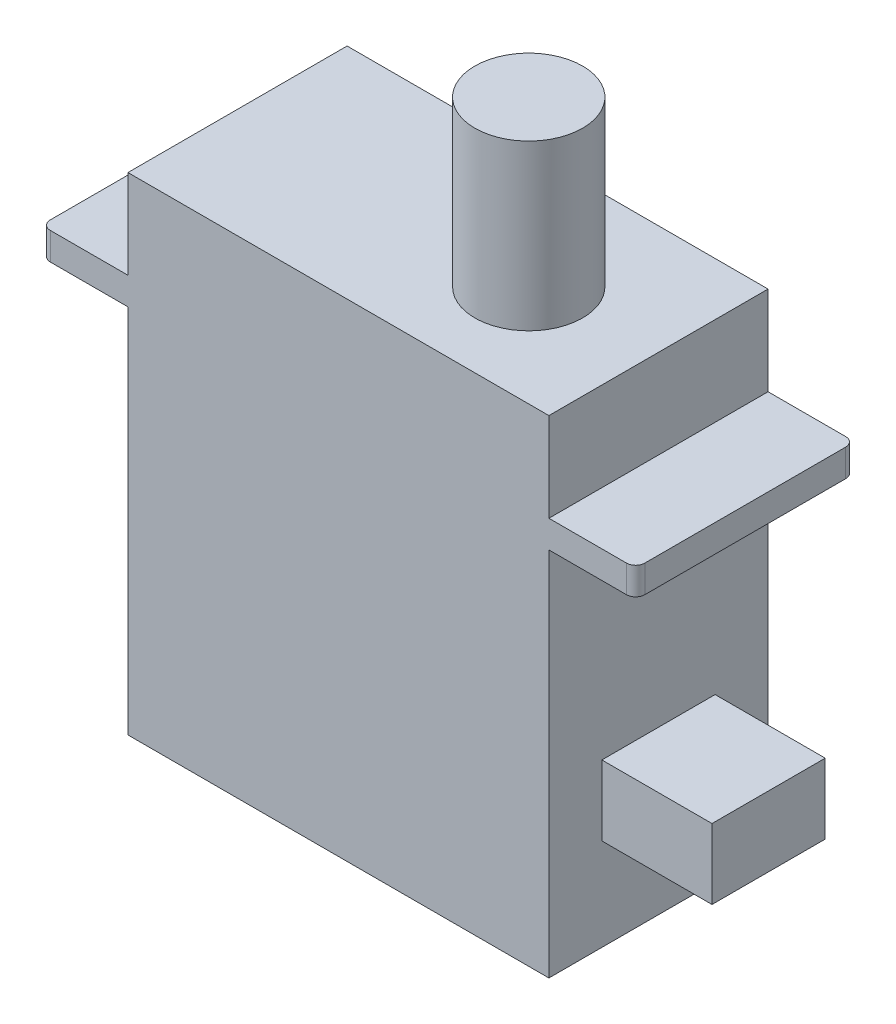
ISO-10303-21;
HEADER;
FILE_DESCRIPTION(('STEP AP214'),'2;1');
FILE_NAME('part.step','',(''),(''),'','','');
FILE_SCHEMA(('AUTOMOTIVE_DESIGN { 1 0 10303 214 1 1 1 1 }'));
ENDSEC;
DATA;
#1=APPLICATION_CONTEXT('core data for automotive mechanical design processes');
#2=APPLICATION_PROTOCOL_DEFINITION('international standard','automotive_design',2000,#1);
#3=PRODUCT_CONTEXT('',#1,'mechanical');
#4=PRODUCT('Part','Part','',(#3));
#5=PRODUCT_RELATED_PRODUCT_CATEGORY('part','',(#4));
#6=PRODUCT_DEFINITION_FORMATION('','',#4);
#7=PRODUCT_DEFINITION_CONTEXT('part definition',#1,'design');
#8=PRODUCT_DEFINITION('design','',#6,#7);
#9=PRODUCT_DEFINITION_SHAPE('','',#8);
#10=(LENGTH_UNIT() NAMED_UNIT(*) SI_UNIT(.MILLI.,.METRE.));
#11=(NAMED_UNIT(*) PLANE_ANGLE_UNIT() SI_UNIT($,.RADIAN.));
#12=(NAMED_UNIT(*) SI_UNIT($,.STERADIAN.) SOLID_ANGLE_UNIT());
#13=UNCERTAINTY_MEASURE_WITH_UNIT(LENGTH_MEASURE(1.E-05),#10,'distance_accuracy_value','');
#14=(GEOMETRIC_REPRESENTATION_CONTEXT(3) GLOBAL_UNCERTAINTY_ASSIGNED_CONTEXT((#13)) GLOBAL_UNIT_ASSIGNED_CONTEXT((#10,
#11,#12)) REPRESENTATION_CONTEXT('',''));
#15=CARTESIAN_POINT('',(0.,0.,0.));
#16=DIRECTION('',(0.,0.,1.));
#17=DIRECTION('',(1.,0.,0.));
#18=AXIS2_PLACEMENT_3D('',#15,#16,#17);
#19=CARTESIAN_POINT('',(23.05,0.,12.));
#20=DIRECTION('',(-1.,0.,0.));
#21=DIRECTION('',(0.,0.,1.));
#22=AXIS2_PLACEMENT_3D('',#19,#20,#21);
#23=PLANE('',#22);
#24=DIRECTION('',(0.,0.,-1.));
#25=VECTOR('',#24,1.);
#26=CARTESIAN_POINT('',(23.05,20.3,12.));
#27=LINE('',#26,#25);
#28=CARTESIAN_POINT('',(23.05,20.3,12.));
#29=VERTEX_POINT('',#28);
#30=CARTESIAN_POINT('',(23.05,20.3,0.));
#31=VERTEX_POINT('',#30);
#32=EDGE_CURVE('E221',#29,#31,#27,.T.);
#33=ORIENTED_EDGE('',*,*,#32,.F.);
#34=DIRECTION('',(0.,1.,0.));
#35=VECTOR('',#34,1.);
#36=CARTESIAN_POINT('',(23.05,0.,12.));
#37=LINE('',#36,#35);
#38=CARTESIAN_POINT('',(23.05,0.,12.));
#39=VERTEX_POINT('',#38);
#40=EDGE_CURVE('E252',#39,#29,#37,.T.);
#41=ORIENTED_EDGE('',*,*,#40,.F.);
#42=DIRECTION('',(0.,0.,-1.));
#43=VECTOR('',#42,1.);
#44=CARTESIAN_POINT('',(23.05,0.,12.));
#45=LINE('',#44,#43);
#46=CARTESIAN_POINT('',(23.05,0.,0.));
#47=VERTEX_POINT('',#46);
#48=EDGE_CURVE('E273',#39,#47,#45,.T.);
#49=ORIENTED_EDGE('',*,*,#48,.T.);
#50=DIRECTION('',(0.,1.,0.));
#51=VECTOR('',#50,1.);
#52=CARTESIAN_POINT('',(23.05,0.,0.));
#53=LINE('',#52,#51);
#54=EDGE_CURVE('E262',#47,#31,#53,.T.);
#55=ORIENTED_EDGE('',*,*,#54,.T.);
#56=EDGE_LOOP('',(#33,#41,#49,#55));
#57=FACE_BOUND('',#56,.T.);
#58=DIRECTION('',(0.,-1.,0.));
#59=VECTOR('',#58,1.);
#60=CARTESIAN_POINT('',(23.05,8.89,9.1));
#61=LINE('',#60,#59);
#62=CARTESIAN_POINT('',(23.05,8.89,9.1));
#63=VERTEX_POINT('',#62);
#64=CARTESIAN_POINT('',(23.05,5.05,9.1));
#65=VERTEX_POINT('',#64);
#66=EDGE_CURVE('E196',#63,#65,#61,.T.);
#67=ORIENTED_EDGE('',*,*,#66,.F.);
#68=DIRECTION('',(0.,0.,1.));
#69=VECTOR('',#68,1.);
#70=CARTESIAN_POINT('',(23.05,8.89,9.1));
#71=LINE('',#70,#69);
#72=CARTESIAN_POINT('',(23.05,8.89,2.9));
#73=VERTEX_POINT('',#72);
#74=EDGE_CURVE('E194',#73,#63,#71,.T.);
#75=ORIENTED_EDGE('',*,*,#74,.F.);
#76=DIRECTION('',(0.,1.,0.));
#77=VECTOR('',#76,1.);
#78=CARTESIAN_POINT('',(23.05,8.89,2.9));
#79=LINE('',#78,#77);
#80=CARTESIAN_POINT('',(23.05,5.05,2.9));
#81=VERTEX_POINT('',#80);
#82=EDGE_CURVE('E63',#81,#73,#79,.T.);
#83=ORIENTED_EDGE('',*,*,#82,.F.);
#84=DIRECTION('',(0.,0.,-1.));
#85=VECTOR('',#84,1.);
#86=CARTESIAN_POINT('',(23.05,5.05,9.1));
#87=LINE('',#86,#85);
#88=EDGE_CURVE('E57',#65,#81,#87,.T.);
#89=ORIENTED_EDGE('',*,*,#88,.F.);
#90=EDGE_LOOP('',(#67,#75,#83,#89));
#91=FACE_BOUND('',#90,.T.);
#92=ADVANCED_FACE('F41',(#57,#91),#23,.F.);
#93=CARTESIAN_POINT('',(0.,0.,12.));
#94=DIRECTION('',(1.,0.,0.));
#95=DIRECTION('',(0.,0.,-1.));
#96=AXIS2_PLACEMENT_3D('',#93,#94,#95);
#97=PLANE('',#96);
#98=DIRECTION('',(0.,0.,-1.));
#99=VECTOR('',#98,1.);
#100=CARTESIAN_POINT('',(0.,21.8,0.));
#101=LINE('',#100,#99);
#102=CARTESIAN_POINT('',(0.,21.8,12.));
#103=VERTEX_POINT('',#102);
#104=CARTESIAN_POINT('',(0.,21.8,0.));
#105=VERTEX_POINT('',#104);
#106=EDGE_CURVE('E205',#103,#105,#101,.T.);
#107=ORIENTED_EDGE('',*,*,#106,.F.);
#108=DIRECTION('',(0.,-1.,0.));
#109=VECTOR('',#108,1.);
#110=CARTESIAN_POINT('',(0.,0.,12.));
#111=LINE('',#110,#109);
#112=CARTESIAN_POINT('',(0.,26.67,12.));
#113=VERTEX_POINT('',#112);
#114=EDGE_CURVE('E241',#113,#103,#111,.T.);
#115=ORIENTED_EDGE('',*,*,#114,.F.);
#116=DIRECTION('',(0.,0.,-1.));
#117=VECTOR('',#116,1.);
#118=CARTESIAN_POINT('',(0.,26.67,12.));
#119=LINE('',#118,#117);
#120=CARTESIAN_POINT('',(0.,26.67,0.));
#121=VERTEX_POINT('',#120);
#122=EDGE_CURVE('E260',#113,#121,#119,.T.);
#123=ORIENTED_EDGE('',*,*,#122,.T.);
#124=DIRECTION('',(0.,-1.,0.));
#125=VECTOR('',#124,1.);
#126=CARTESIAN_POINT('',(0.,0.,0.));
#127=LINE('',#126,#125);
#128=EDGE_CURVE('E256',#121,#105,#127,.T.);
#129=ORIENTED_EDGE('',*,*,#128,.T.);
#130=EDGE_LOOP('',(#107,#115,#123,#129));
#131=FACE_BOUND('',#130,.T.);
#132=ADVANCED_FACE('F386',(#131),#97,.F.);
#133=DIRECTION('',(0.,0.,1.));
#134=VECTOR('',#133,1.);
#135=CARTESIAN_POINT('',(0.,20.3,0.));
#136=LINE('',#135,#134);
#137=CARTESIAN_POINT('',(0.,20.3,0.));
#138=VERTEX_POINT('',#137);
#139=CARTESIAN_POINT('',(0.,20.3,12.));
#140=VERTEX_POINT('',#139);
#141=EDGE_CURVE('E200',#138,#140,#136,.T.);
#142=ORIENTED_EDGE('',*,*,#141,.F.);
#143=CARTESIAN_POINT('',(0.,0.,0.));
#144=VERTEX_POINT('',#143);
#145=EDGE_CURVE('E245',#138,#144,#127,.T.);
#146=ORIENTED_EDGE('',*,*,#145,.T.);
#147=DIRECTION('',(0.,0.,-1.));
#148=VECTOR('',#147,1.);
#149=CARTESIAN_POINT('',(0.,0.,12.));
#150=LINE('',#149,#148);
#151=CARTESIAN_POINT('',(0.,0.,12.));
#152=VERTEX_POINT('',#151);
#153=EDGE_CURVE('E280',#152,#144,#150,.T.);
#154=ORIENTED_EDGE('',*,*,#153,.F.);
#155=EDGE_CURVE('E247',#140,#152,#111,.T.);
#156=ORIENTED_EDGE('',*,*,#155,.F.);
#157=EDGE_LOOP('',(#142,#146,#154,#156));
#158=FACE_BOUND('',#157,.T.);
#159=ADVANCED_FACE('F342',(#158),#97,.F.);
#160=DIRECTION('',(0.,0.,1.));
#161=VECTOR('',#160,1.);
#162=CARTESIAN_POINT('',(23.05,21.8,12.));
#163=LINE('',#162,#161);
#164=CARTESIAN_POINT('',(23.05,21.8,0.));
#165=VERTEX_POINT('',#164);
#166=CARTESIAN_POINT('',(23.05,21.8,12.));
#167=VERTEX_POINT('',#166);
#168=EDGE_CURVE('E227',#165,#167,#163,.T.);
#169=ORIENTED_EDGE('',*,*,#168,.F.);
#170=CARTESIAN_POINT('',(23.05,26.67,0.));
#171=VERTEX_POINT('',#170);
#172=EDGE_CURVE('E263',#165,#171,#53,.T.);
#173=ORIENTED_EDGE('',*,*,#172,.T.);
#174=DIRECTION('',(0.,0.,-1.));
#175=VECTOR('',#174,1.);
#176=CARTESIAN_POINT('',(23.05,26.67,12.));
#177=LINE('',#176,#175);
#178=CARTESIAN_POINT('',(23.05,26.67,12.));
#179=VERTEX_POINT('',#178);
#180=EDGE_CURVE('E271',#179,#171,#177,.T.);
#181=ORIENTED_EDGE('',*,*,#180,.F.);
#182=EDGE_CURVE('E253',#167,#179,#37,.T.);
#183=ORIENTED_EDGE('',*,*,#182,.F.);
#184=EDGE_LOOP('',(#169,#173,#181,#183));
#185=FACE_BOUND('',#184,.T.);
#186=ADVANCED_FACE('F379',(#185),#23,.F.);
#187=CARTESIAN_POINT('',(0.,0.,12.));
#188=DIRECTION('',(0.,1.,0.));
#189=DIRECTION('',(0.,0.,1.));
#190=AXIS2_PLACEMENT_3D('',#187,#188,#189);
#191=PLANE('',#190);
#192=DIRECTION('',(1.,0.,0.));
#193=VECTOR('',#192,1.);
#194=CARTESIAN_POINT('',(0.,0.,0.));
#195=LINE('',#194,#193);
#196=EDGE_CURVE('E261',#144,#47,#195,.T.);
#197=ORIENTED_EDGE('',*,*,#196,.T.);
#198=ORIENTED_EDGE('',*,*,#48,.F.);
#199=DIRECTION('',(1.,0.,0.));
#200=VECTOR('',#199,1.);
#201=CARTESIAN_POINT('',(0.,0.,12.));
#202=LINE('',#201,#200);
#203=EDGE_CURVE('E246',#152,#39,#202,.T.);
#204=ORIENTED_EDGE('',*,*,#203,.F.);
#205=ORIENTED_EDGE('',*,*,#153,.T.);
#206=EDGE_LOOP('',(#197,#198,#204,#205));
#207=FACE_BOUND('',#206,.T.);
#208=ADVANCED_FACE('F349',(#207),#191,.F.);
#209=CARTESIAN_POINT('',(0.,26.67,12.));
#210=DIRECTION('',(0.,-1.,0.));
#211=DIRECTION('',(0.,0.,-1.));
#212=AXIS2_PLACEMENT_3D('',#209,#210,#211);
#213=PLANE('',#212);
#214=CARTESIAN_POINT('',(16.3955675032536,26.67,6.44973763746406));
#215=DIRECTION('',(0.,-1.,0.));
#216=DIRECTION('',(0.,0.,-1.));
#217=AXIS2_PLACEMENT_3D('',#214,#215,#216);
#218=CIRCLE('',#217,2.95);
#219=CARTESIAN_POINT('',(16.3955675032536,26.67,3.49973763746406));
#220=VERTEX_POINT('',#219);
#221=EDGE_CURVE('E11',#220,#220,#218,.F.);
#222=ORIENTED_EDGE('',*,*,#221,.F.);
#223=EDGE_LOOP('',(#222));
#224=FACE_BOUND('',#223,.T.);
#225=DIRECTION('',(-1.,0.,0.));
#226=VECTOR('',#225,1.);
#227=CARTESIAN_POINT('',(0.,26.67,0.));
#228=LINE('',#227,#226);
#229=EDGE_CURVE('E270',#171,#121,#228,.T.);
#230=ORIENTED_EDGE('',*,*,#229,.T.);
#231=ORIENTED_EDGE('',*,*,#122,.F.);
#232=DIRECTION('',(-1.,0.,0.));
#233=VECTOR('',#232,1.);
#234=CARTESIAN_POINT('',(0.,26.67,12.));
#235=LINE('',#234,#233);
#236=EDGE_CURVE('E254',#179,#113,#235,.T.);
#237=ORIENTED_EDGE('',*,*,#236,.F.);
#238=ORIENTED_EDGE('',*,*,#180,.T.);
#239=EDGE_LOOP('',(#230,#231,#237,#238));
#240=FACE_BOUND('',#239,.T.);
#241=ADVANCED_FACE('F383',(#224,#240),#213,.F.);
#242=CARTESIAN_POINT('',(0.,0.,12.));
#243=DIRECTION('',(0.,0.,-1.));
#244=DIRECTION('',(-1.,0.,0.));
#245=AXIS2_PLACEMENT_3D('',#242,#243,#244);
#246=PLANE('',#245);
#247=DIRECTION('',(1.,0.,0.));
#248=VECTOR('',#247,1.);
#249=CARTESIAN_POINT('',(-4.75,21.8,12.));
#250=LINE('',#249,#248);
#251=CARTESIAN_POINT('',(-4.25,21.8,12.));
#252=VERTEX_POINT('',#251);
#253=EDGE_CURVE('E217',#252,#103,#250,.T.);
#254=ORIENTED_EDGE('',*,*,#253,.F.);
#255=DIRECTION('',(0.,1.,0.));
#256=VECTOR('',#255,1.);
#257=CARTESIAN_POINT('',(-4.25,20.3,12.));
#258=LINE('',#257,#256);
#259=CARTESIAN_POINT('',(-4.25,20.3,12.));
#260=VERTEX_POINT('',#259);
#261=EDGE_CURVE('E47',#252,#260,#258,.F.);
#262=ORIENTED_EDGE('',*,*,#261,.T.);
#263=DIRECTION('',(1.,0.,0.));
#264=VECTOR('',#263,1.);
#265=CARTESIAN_POINT('',(-4.75,20.3,12.));
#266=LINE('',#265,#264);
#267=EDGE_CURVE('E219',#260,#140,#266,.T.);
#268=ORIENTED_EDGE('',*,*,#267,.T.);
#269=ORIENTED_EDGE('',*,*,#155,.T.);
#270=ORIENTED_EDGE('',*,*,#203,.T.);
#271=ORIENTED_EDGE('',*,*,#40,.T.);
#272=DIRECTION('',(-1.,0.,0.));
#273=VECTOR('',#272,1.);
#274=CARTESIAN_POINT('',(27.8,20.3,12.));
#275=LINE('',#274,#273);
#276=CARTESIAN_POINT('',(27.3,20.3,12.));
#277=VERTEX_POINT('',#276);
#278=EDGE_CURVE('E244',#277,#29,#275,.T.);
#279=ORIENTED_EDGE('',*,*,#278,.F.);
#280=DIRECTION('',(0.,-1.,0.));
#281=VECTOR('',#280,1.);
#282=CARTESIAN_POINT('',(27.3,21.8,12.));
#283=LINE('',#282,#281);
#284=CARTESIAN_POINT('',(27.3,21.8,12.));
#285=VERTEX_POINT('',#284);
#286=EDGE_CURVE('E298',#277,#285,#283,.F.);
#287=ORIENTED_EDGE('',*,*,#286,.T.);
#288=DIRECTION('',(-1.,0.,0.));
#289=VECTOR('',#288,1.);
#290=CARTESIAN_POINT('',(27.8,21.8,12.));
#291=LINE('',#290,#289);
#292=EDGE_CURVE('E231',#285,#167,#291,.T.);
#293=ORIENTED_EDGE('',*,*,#292,.T.);
#294=ORIENTED_EDGE('',*,*,#182,.T.);
#295=ORIENTED_EDGE('',*,*,#236,.T.);
#296=ORIENTED_EDGE('',*,*,#114,.T.);
#297=EDGE_LOOP('',(#254,#262,#268,#269,#270,#271,#279,#287,#293,#294,#295,#296));
#298=FACE_BOUND('',#297,.T.);
#299=ADVANCED_FACE('F320',(#298),#246,.F.);
#300=CARTESIAN_POINT('',(0.,0.,0.));
#301=DIRECTION('',(0.,0.,-1.));
#302=DIRECTION('',(-1.,0.,0.));
#303=AXIS2_PLACEMENT_3D('',#300,#301,#302);
#304=PLANE('',#303);
#305=DIRECTION('',(1.,0.,0.));
#306=VECTOR('',#305,1.);
#307=CARTESIAN_POINT('',(-4.75,20.3,0.));
#308=LINE('',#307,#306);
#309=CARTESIAN_POINT('',(-4.25,20.3,0.));
#310=VERTEX_POINT('',#309);
#311=EDGE_CURVE('E225',#310,#138,#308,.T.);
#312=ORIENTED_EDGE('',*,*,#311,.F.);
#313=DIRECTION('',(0.,-1.,0.));
#314=VECTOR('',#313,1.);
#315=CARTESIAN_POINT('',(-4.25,0.,0.));
#316=LINE('',#315,#314);
#317=CARTESIAN_POINT('',(-4.25,21.8,0.));
#318=VERTEX_POINT('',#317);
#319=EDGE_CURVE('E306',#310,#318,#316,.F.);
#320=ORIENTED_EDGE('',*,*,#319,.T.);
#321=DIRECTION('',(1.,0.,0.));
#322=VECTOR('',#321,1.);
#323=CARTESIAN_POINT('',(-4.75,21.8,0.));
#324=LINE('',#323,#322);
#325=EDGE_CURVE('E213',#318,#105,#324,.T.);
#326=ORIENTED_EDGE('',*,*,#325,.T.);
#327=ORIENTED_EDGE('',*,*,#128,.F.);
#328=ORIENTED_EDGE('',*,*,#229,.F.);
#329=ORIENTED_EDGE('',*,*,#172,.F.);
#330=DIRECTION('',(-1.,0.,0.));
#331=VECTOR('',#330,1.);
#332=CARTESIAN_POINT('',(27.8,21.8,0.));
#333=LINE('',#332,#331);
#334=CARTESIAN_POINT('',(27.3,21.8,0.));
#335=VERTEX_POINT('',#334);
#336=EDGE_CURVE('E236',#335,#165,#333,.T.);
#337=ORIENTED_EDGE('',*,*,#336,.F.);
#338=DIRECTION('',(0.,1.,0.));
#339=VECTOR('',#338,1.);
#340=CARTESIAN_POINT('',(27.3,0.,0.));
#341=LINE('',#340,#339);
#342=CARTESIAN_POINT('',(27.3,20.3,0.));
#343=VERTEX_POINT('',#342);
#344=EDGE_CURVE('E287',#335,#343,#341,.F.);
#345=ORIENTED_EDGE('',*,*,#344,.T.);
#346=DIRECTION('',(-1.,0.,0.));
#347=VECTOR('',#346,1.);
#348=CARTESIAN_POINT('',(27.8,20.3,0.));
#349=LINE('',#348,#347);
#350=EDGE_CURVE('E238',#343,#31,#349,.T.);
#351=ORIENTED_EDGE('',*,*,#350,.T.);
#352=ORIENTED_EDGE('',*,*,#54,.F.);
#353=ORIENTED_EDGE('',*,*,#196,.F.);
#354=ORIENTED_EDGE('',*,*,#145,.F.);
#355=EDGE_LOOP('',(#312,#320,#326,#327,#328,#329,#337,#345,#351,#352,#353,#354));
#356=FACE_BOUND('',#355,.T.);
#357=ADVANCED_FACE('F339',(#356),#304,.T.);
#358=CARTESIAN_POINT('',(27.8,20.3,12.));
#359=DIRECTION('',(0.,1.,0.));
#360=DIRECTION('',(0.,0.,1.));
#361=AXIS2_PLACEMENT_3D('',#358,#359,#360);
#362=PLANE('',#361);
#363=ORIENTED_EDGE('',*,*,#350,.F.);
#364=CARTESIAN_POINT('',(27.3,20.3,0.5));
#365=DIRECTION('',(0.,1.,0.));
#366=DIRECTION('',(0.,0.,1.));
#367=AXIS2_PLACEMENT_3D('',#364,#365,#366);
#368=CIRCLE('',#367,0.5);
#369=CARTESIAN_POINT('',(27.8,20.3,0.5));
#370=VERTEX_POINT('',#369);
#371=EDGE_CURVE('E294',#343,#370,#368,.F.);
#372=ORIENTED_EDGE('',*,*,#371,.T.);
#373=DIRECTION('',(0.,0.,-1.));
#374=VECTOR('',#373,1.);
#375=CARTESIAN_POINT('',(27.8,20.3,12.));
#376=LINE('',#375,#374);
#377=CARTESIAN_POINT('',(27.8,20.3,11.5));
#378=VERTEX_POINT('',#377);
#379=EDGE_CURVE('E223',#378,#370,#376,.T.);
#380=ORIENTED_EDGE('',*,*,#379,.F.);
#381=CARTESIAN_POINT('',(27.3,20.3,11.5));
#382=DIRECTION('',(0.,1.,0.));
#383=DIRECTION('',(0.,0.,1.));
#384=AXIS2_PLACEMENT_3D('',#381,#382,#383);
#385=CIRCLE('',#384,0.5);
#386=EDGE_CURVE('E295',#378,#277,#385,.F.);
#387=ORIENTED_EDGE('',*,*,#386,.T.);
#388=ORIENTED_EDGE('',*,*,#278,.T.);
#389=ORIENTED_EDGE('',*,*,#32,.T.);
#390=EDGE_LOOP('',(#363,#372,#380,#387,#388,#389));
#391=FACE_BOUND('',#390,.T.);
#392=ADVANCED_FACE('F423',(#391),#362,.F.);
#393=CARTESIAN_POINT('',(27.8,21.8,12.));
#394=DIRECTION('',(0.,-1.,0.));
#395=DIRECTION('',(0.,0.,-1.));
#396=AXIS2_PLACEMENT_3D('',#393,#394,#395);
#397=PLANE('',#396);
#398=DIRECTION('',(0.,0.,1.));
#399=VECTOR('',#398,1.);
#400=CARTESIAN_POINT('',(27.8,21.8,12.));
#401=LINE('',#400,#399);
#402=CARTESIAN_POINT('',(27.8,21.8,0.5));
#403=VERTEX_POINT('',#402);
#404=CARTESIAN_POINT('',(27.8,21.8,11.5));
#405=VERTEX_POINT('',#404);
#406=EDGE_CURVE('E226',#403,#405,#401,.T.);
#407=ORIENTED_EDGE('',*,*,#406,.F.);
#408=CARTESIAN_POINT('',(27.3,21.8,0.5));
#409=DIRECTION('',(0.,-1.,0.));
#410=DIRECTION('',(0.,0.,-1.));
#411=AXIS2_PLACEMENT_3D('',#408,#409,#410);
#412=CIRCLE('',#411,0.5);
#413=EDGE_CURVE('E290',#403,#335,#412,.F.);
#414=ORIENTED_EDGE('',*,*,#413,.T.);
#415=ORIENTED_EDGE('',*,*,#336,.T.);
#416=ORIENTED_EDGE('',*,*,#168,.T.);
#417=ORIENTED_EDGE('',*,*,#292,.F.);
#418=CARTESIAN_POINT('',(27.3,21.8,11.5));
#419=DIRECTION('',(0.,-1.,0.));
#420=DIRECTION('',(0.,0.,-1.));
#421=AXIS2_PLACEMENT_3D('',#418,#419,#420);
#422=CIRCLE('',#421,0.5);
#423=EDGE_CURVE('E289',#285,#405,#422,.F.);
#424=ORIENTED_EDGE('',*,*,#423,.T.);
#425=EDGE_LOOP('',(#407,#414,#415,#416,#417,#424));
#426=FACE_BOUND('',#425,.T.);
#427=ADVANCED_FACE('F361',(#426),#397,.F.);
#428=CARTESIAN_POINT('',(27.8,0.,0.));
#429=DIRECTION('',(1.,0.,0.));
#430=DIRECTION('',(0.,0.,-1.));
#431=AXIS2_PLACEMENT_3D('',#428,#429,#430);
#432=PLANE('',#431);
#433=ORIENTED_EDGE('',*,*,#379,.T.);
#434=DIRECTION('',(0.,1.,0.));
#435=VECTOR('',#434,1.);
#436=CARTESIAN_POINT('',(27.8,0.,0.5));
#437=LINE('',#436,#435);
#438=EDGE_CURVE('E281',#370,#403,#437,.T.);
#439=ORIENTED_EDGE('',*,*,#438,.T.);
#440=ORIENTED_EDGE('',*,*,#406,.T.);
#441=DIRECTION('',(0.,-1.,0.));
#442=VECTOR('',#441,1.);
#443=CARTESIAN_POINT('',(27.8,20.3,11.5));
#444=LINE('',#443,#442);
#445=EDGE_CURVE('E278',#405,#378,#444,.T.);
#446=ORIENTED_EDGE('',*,*,#445,.T.);
#447=EDGE_LOOP('',(#433,#439,#440,#446));
#448=FACE_BOUND('',#447,.T.);
#449=ADVANCED_FACE('F364',(#448),#432,.T.);
#450=CARTESIAN_POINT('',(27.3,0.,0.5));
#451=DIRECTION('',(0.,1.,0.));
#452=DIRECTION('',(0.,0.,1.));
#453=AXIS2_PLACEMENT_3D('',#450,#451,#452);
#454=CYLINDRICAL_SURFACE('',#453,0.5);
#455=ORIENTED_EDGE('',*,*,#371,.F.);
#456=ORIENTED_EDGE('',*,*,#344,.F.);
#457=ORIENTED_EDGE('',*,*,#413,.F.);
#458=ORIENTED_EDGE('',*,*,#438,.F.);
#459=EDGE_LOOP('',(#455,#456,#457,#458));
#460=FACE_BOUND('',#459,.T.);
#461=ADVANCED_FACE('F367',(#460),#454,.T.);
#462=CARTESIAN_POINT('',(27.3,0.,11.5));
#463=DIRECTION('',(0.,1.,0.));
#464=DIRECTION('',(0.,0.,1.));
#465=AXIS2_PLACEMENT_3D('',#462,#463,#464);
#466=CYLINDRICAL_SURFACE('',#465,0.5);
#467=ORIENTED_EDGE('',*,*,#423,.F.);
#468=ORIENTED_EDGE('',*,*,#286,.F.);
#469=ORIENTED_EDGE('',*,*,#386,.F.);
#470=ORIENTED_EDGE('',*,*,#445,.F.);
#471=EDGE_LOOP('',(#467,#468,#469,#470));
#472=FACE_BOUND('',#471,.T.);
#473=ADVANCED_FACE('F357',(#472),#466,.T.);
#474=CARTESIAN_POINT('',(-4.75,20.3,0.));
#475=DIRECTION('',(0.,1.,0.));
#476=DIRECTION('',(0.,0.,1.));
#477=AXIS2_PLACEMENT_3D('',#474,#475,#476);
#478=PLANE('',#477);
#479=DIRECTION('',(0.,0.,1.));
#480=VECTOR('',#479,1.);
#481=CARTESIAN_POINT('',(-4.75,20.3,0.));
#482=LINE('',#481,#480);
#483=CARTESIAN_POINT('',(-4.75,20.3,0.5));
#484=VERTEX_POINT('',#483);
#485=CARTESIAN_POINT('',(-4.75,20.3,11.5));
#486=VERTEX_POINT('',#485);
#487=EDGE_CURVE('E208',#484,#486,#482,.T.);
#488=ORIENTED_EDGE('',*,*,#487,.F.);
#489=CARTESIAN_POINT('',(-4.25,20.3,0.5));
#490=DIRECTION('',(0.,1.,0.));
#491=DIRECTION('',(0.,0.,1.));
#492=AXIS2_PLACEMENT_3D('',#489,#490,#491);
#493=CIRCLE('',#492,0.5);
#494=EDGE_CURVE('E308',#484,#310,#493,.F.);
#495=ORIENTED_EDGE('',*,*,#494,.T.);
#496=ORIENTED_EDGE('',*,*,#311,.T.);
#497=ORIENTED_EDGE('',*,*,#141,.T.);
#498=ORIENTED_EDGE('',*,*,#267,.F.);
#499=CARTESIAN_POINT('',(-4.25,20.3,11.5));
#500=DIRECTION('',(0.,1.,0.));
#501=DIRECTION('',(0.,0.,1.));
#502=AXIS2_PLACEMENT_3D('',#499,#500,#501);
#503=CIRCLE('',#502,0.5);
#504=EDGE_CURVE('E302',#260,#486,#503,.F.);
#505=ORIENTED_EDGE('',*,*,#504,.T.);
#506=EDGE_LOOP('',(#488,#495,#496,#497,#498,#505));
#507=FACE_BOUND('',#506,.T.);
#508=ADVANCED_FACE('F323',(#507),#478,.F.);
#509=CARTESIAN_POINT('',(-4.75,21.8,0.));
#510=DIRECTION('',(0.,-1.,0.));
#511=DIRECTION('',(0.,0.,-1.));
#512=AXIS2_PLACEMENT_3D('',#509,#510,#511);
#513=PLANE('',#512);
#514=ORIENTED_EDGE('',*,*,#325,.F.);
#515=CARTESIAN_POINT('',(-4.25,21.8,0.5));
#516=DIRECTION('',(0.,-1.,0.));
#517=DIRECTION('',(0.,0.,-1.));
#518=AXIS2_PLACEMENT_3D('',#515,#516,#517);
#519=CIRCLE('',#518,0.5);
#520=CARTESIAN_POINT('',(-4.75,21.8,0.5));
#521=VERTEX_POINT('',#520);
#522=EDGE_CURVE('E315',#318,#521,#519,.F.);
#523=ORIENTED_EDGE('',*,*,#522,.T.);
#524=DIRECTION('',(0.,0.,-1.));
#525=VECTOR('',#524,1.);
#526=CARTESIAN_POINT('',(-4.75,21.8,0.));
#527=LINE('',#526,#525);
#528=CARTESIAN_POINT('',(-4.75,21.8,11.5));
#529=VERTEX_POINT('',#528);
#530=EDGE_CURVE('E211',#529,#521,#527,.T.);
#531=ORIENTED_EDGE('',*,*,#530,.F.);
#532=CARTESIAN_POINT('',(-4.25,21.8,11.5));
#533=DIRECTION('',(0.,-1.,0.));
#534=DIRECTION('',(0.,0.,-1.));
#535=AXIS2_PLACEMENT_3D('',#532,#533,#534);
#536=CIRCLE('',#535,0.5);
#537=EDGE_CURVE('E309',#529,#252,#536,.F.);
#538=ORIENTED_EDGE('',*,*,#537,.T.);
#539=ORIENTED_EDGE('',*,*,#253,.T.);
#540=ORIENTED_EDGE('',*,*,#106,.T.);
#541=EDGE_LOOP('',(#514,#523,#531,#538,#539,#540));
#542=FACE_BOUND('',#541,.T.);
#543=ADVANCED_FACE('F335',(#542),#513,.F.);
#544=CARTESIAN_POINT('',(-4.75,0.,0.));
#545=DIRECTION('',(-1.,0.,0.));
#546=DIRECTION('',(0.,0.,1.));
#547=AXIS2_PLACEMENT_3D('',#544,#545,#546);
#548=PLANE('',#547);
#549=ORIENTED_EDGE('',*,*,#530,.T.);
#550=DIRECTION('',(0.,-1.,0.));
#551=VECTOR('',#550,1.);
#552=CARTESIAN_POINT('',(-4.75,0.,0.5));
#553=LINE('',#552,#551);
#554=EDGE_CURVE('E303',#521,#484,#553,.T.);
#555=ORIENTED_EDGE('',*,*,#554,.T.);
#556=ORIENTED_EDGE('',*,*,#487,.T.);
#557=DIRECTION('',(0.,1.,0.));
#558=VECTOR('',#557,1.);
#559=CARTESIAN_POINT('',(-4.75,21.8,11.5));
#560=LINE('',#559,#558);
#561=EDGE_CURVE('E297',#486,#529,#560,.T.);
#562=ORIENTED_EDGE('',*,*,#561,.T.);
#563=EDGE_LOOP('',(#549,#555,#556,#562));
#564=FACE_BOUND('',#563,.T.);
#565=ADVANCED_FACE('F327',(#564),#548,.T.);
#566=CARTESIAN_POINT('',(-4.25,0.,0.5));
#567=DIRECTION('',(0.,-1.,0.));
#568=DIRECTION('',(0.,0.,-1.));
#569=AXIS2_PLACEMENT_3D('',#566,#567,#568);
#570=CYLINDRICAL_SURFACE('',#569,0.5);
#571=ORIENTED_EDGE('',*,*,#522,.F.);
#572=ORIENTED_EDGE('',*,*,#319,.F.);
#573=ORIENTED_EDGE('',*,*,#494,.F.);
#574=ORIENTED_EDGE('',*,*,#554,.F.);
#575=EDGE_LOOP('',(#571,#572,#573,#574));
#576=FACE_BOUND('',#575,.T.);
#577=ADVANCED_FACE('F338',(#576),#570,.T.);
#578=CARTESIAN_POINT('',(-4.25,0.,11.5));
#579=DIRECTION('',(0.,-1.,0.));
#580=DIRECTION('',(0.,0.,-1.));
#581=AXIS2_PLACEMENT_3D('',#578,#579,#580);
#582=CYLINDRICAL_SURFACE('',#581,0.5);
#583=ORIENTED_EDGE('',*,*,#504,.F.);
#584=ORIENTED_EDGE('',*,*,#261,.F.);
#585=ORIENTED_EDGE('',*,*,#537,.F.);
#586=ORIENTED_EDGE('',*,*,#561,.F.);
#587=EDGE_LOOP('',(#583,#584,#585,#586));
#588=FACE_BOUND('',#587,.T.);
#589=ADVANCED_FACE('F43',(#588),#582,.T.);
#590=CARTESIAN_POINT('',(29.08,8.89,9.1));
#591=DIRECTION('',(0.,0.,-1.));
#592=DIRECTION('',(-1.,0.,0.));
#593=AXIS2_PLACEMENT_3D('',#590,#591,#592);
#594=PLANE('',#593);
#595=ORIENTED_EDGE('',*,*,#66,.T.);
#596=DIRECTION('',(-1.,0.,0.));
#597=VECTOR('',#596,1.);
#598=CARTESIAN_POINT('',(29.08,5.05,9.1));
#599=LINE('',#598,#597);
#600=CARTESIAN_POINT('',(29.08,5.05,9.1));
#601=VERTEX_POINT('',#600);
#602=EDGE_CURVE('E178',#601,#65,#599,.T.);
#603=ORIENTED_EDGE('',*,*,#602,.F.);
#604=DIRECTION('',(0.,-1.,0.));
#605=VECTOR('',#604,1.);
#606=CARTESIAN_POINT('',(29.08,8.89,9.1));
#607=LINE('',#606,#605);
#608=CARTESIAN_POINT('',(29.08,8.89,9.1));
#609=VERTEX_POINT('',#608);
#610=EDGE_CURVE('E188',#609,#601,#607,.T.);
#611=ORIENTED_EDGE('',*,*,#610,.F.);
#612=DIRECTION('',(-1.,0.,0.));
#613=VECTOR('',#612,1.);
#614=CARTESIAN_POINT('',(29.08,8.89,9.1));
#615=LINE('',#614,#613);
#616=EDGE_CURVE('E562',#609,#63,#615,.T.);
#617=ORIENTED_EDGE('',*,*,#616,.T.);
#618=EDGE_LOOP('',(#595,#603,#611,#617));
#619=FACE_BOUND('',#618,.T.);
#620=ADVANCED_FACE('F197',(#619),#594,.F.);
#621=CARTESIAN_POINT('',(29.08,5.05,9.1));
#622=DIRECTION('',(0.,1.,0.));
#623=DIRECTION('',(0.,0.,1.));
#624=AXIS2_PLACEMENT_3D('',#621,#622,#623);
#625=PLANE('',#624);
#626=ORIENTED_EDGE('',*,*,#88,.T.);
#627=DIRECTION('',(-1.,0.,0.));
#628=VECTOR('',#627,1.);
#629=CARTESIAN_POINT('',(29.08,5.05,2.9));
#630=LINE('',#629,#628);
#631=CARTESIAN_POINT('',(29.08,5.05,2.9));
#632=VERTEX_POINT('',#631);
#633=EDGE_CURVE('E185',#632,#81,#630,.T.);
#634=ORIENTED_EDGE('',*,*,#633,.F.);
#635=DIRECTION('',(0.,0.,-1.));
#636=VECTOR('',#635,1.);
#637=CARTESIAN_POINT('',(29.08,5.05,9.1));
#638=LINE('',#637,#636);
#639=EDGE_CURVE('E174',#601,#632,#638,.T.);
#640=ORIENTED_EDGE('',*,*,#639,.F.);
#641=ORIENTED_EDGE('',*,*,#602,.T.);
#642=EDGE_LOOP('',(#626,#634,#640,#641));
#643=FACE_BOUND('',#642,.T.);
#644=ADVANCED_FACE('F176',(#643),#625,.F.);
#645=CARTESIAN_POINT('',(29.08,8.89,2.9));
#646=DIRECTION('',(0.,0.,1.));
#647=DIRECTION('',(0.,-1.,0.));
#648=AXIS2_PLACEMENT_3D('',#645,#646,#647);
#649=PLANE('',#648);
#650=ORIENTED_EDGE('',*,*,#82,.T.);
#651=DIRECTION('',(-1.,0.,0.));
#652=VECTOR('',#651,1.);
#653=CARTESIAN_POINT('',(29.08,8.89,2.9));
#654=LINE('',#653,#652);
#655=CARTESIAN_POINT('',(29.08,8.89,2.9));
#656=VERTEX_POINT('',#655);
#657=EDGE_CURVE('E204',#656,#73,#654,.T.);
#658=ORIENTED_EDGE('',*,*,#657,.F.);
#659=DIRECTION('',(0.,1.,0.));
#660=VECTOR('',#659,1.);
#661=CARTESIAN_POINT('',(29.08,8.89,2.9));
#662=LINE('',#661,#660);
#663=EDGE_CURVE('E183',#632,#656,#662,.T.);
#664=ORIENTED_EDGE('',*,*,#663,.F.);
#665=ORIENTED_EDGE('',*,*,#633,.T.);
#666=EDGE_LOOP('',(#650,#658,#664,#665));
#667=FACE_BOUND('',#666,.T.);
#668=ADVANCED_FACE('F525',(#667),#649,.F.);
#669=CARTESIAN_POINT('',(29.08,8.89,9.1));
#670=DIRECTION('',(0.,-1.,0.));
#671=DIRECTION('',(0.,0.,-1.));
#672=AXIS2_PLACEMENT_3D('',#669,#670,#671);
#673=PLANE('',#672);
#674=ORIENTED_EDGE('',*,*,#74,.T.);
#675=ORIENTED_EDGE('',*,*,#616,.F.);
#676=DIRECTION('',(0.,0.,1.));
#677=VECTOR('',#676,1.);
#678=CARTESIAN_POINT('',(29.08,8.89,9.1));
#679=LINE('',#678,#677);
#680=EDGE_CURVE('E193',#656,#609,#679,.T.);
#681=ORIENTED_EDGE('',*,*,#680,.F.);
#682=ORIENTED_EDGE('',*,*,#657,.T.);
#683=EDGE_LOOP('',(#674,#675,#681,#682));
#684=FACE_BOUND('',#683,.T.);
#685=ADVANCED_FACE('F526',(#684),#673,.F.);
#686=CARTESIAN_POINT('',(29.08,0.,0.));
#687=DIRECTION('',(1.,0.,0.));
#688=DIRECTION('',(0.,0.,-1.));
#689=AXIS2_PLACEMENT_3D('',#686,#687,#688);
#690=PLANE('',#689);
#691=ORIENTED_EDGE('',*,*,#610,.T.);
#692=ORIENTED_EDGE('',*,*,#639,.T.);
#693=ORIENTED_EDGE('',*,*,#663,.T.);
#694=ORIENTED_EDGE('',*,*,#680,.T.);
#695=EDGE_LOOP('',(#691,#692,#693,#694));
#696=FACE_BOUND('',#695,.T.);
#697=ADVANCED_FACE('F190',(#696),#690,.T.);
#698=CARTESIAN_POINT('',(16.3955675032536,35.67,6.44973763746406));
#699=DIRECTION('',(0.,-1.,0.));
#700=DIRECTION('',(0.,0.,-1.));
#701=AXIS2_PLACEMENT_3D('',#698,#699,#700);
#702=CYLINDRICAL_SURFACE('',#701,2.95);
#703=CARTESIAN_POINT('',(16.3955675032536,35.67,6.44973763746406));
#704=DIRECTION('',(0.,1.,0.));
#705=DIRECTION('',(0.,0.,1.));
#706=AXIS2_PLACEMENT_3D('',#703,#704,#705);
#707=CIRCLE('',#706,2.95);
#708=CARTESIAN_POINT('',(16.3955675032536,35.67,9.39973763746406));
#709=VERTEX_POINT('',#708);
#710=EDGE_CURVE('E559',#709,#709,#707,.T.);
#711=ORIENTED_EDGE('',*,*,#710,.F.);
#712=EDGE_LOOP('',(#711));
#713=FACE_BOUND('',#712,.T.);
#714=ORIENTED_EDGE('',*,*,#221,.T.);
#715=EDGE_LOOP('',(#714));
#716=FACE_BOUND('',#715,.T.);
#717=ADVANCED_FACE('F545',(#713,#716),#702,.T.);
#718=CARTESIAN_POINT('',(16.3955675032536,35.67,6.44973763746406));
#719=DIRECTION('',(0.,1.,0.));
#720=DIRECTION('',(0.,0.,1.));
#721=AXIS2_PLACEMENT_3D('',#718,#719,#720);
#722=PLANE('',#721);
#723=ORIENTED_EDGE('',*,*,#710,.T.);
#724=EDGE_LOOP('',(#723));
#725=FACE_BOUND('',#724,.T.);
#726=ADVANCED_FACE('F547',(#725),#722,.T.);
#727=CLOSED_SHELL('',(#92,#132,#159,#186,#208,#241,#299,#357,#392,#427,#449,#461,#473,#508,#543,
#565,#577,#589,#620,#644,#668,#685,#697,#717,#726));
#728=MANIFOLD_SOLID_BREP('B2',#727);
#729=ADVANCED_BREP_SHAPE_REPRESENTATION('',(#18,#728),#14);
#730=SHAPE_DEFINITION_REPRESENTATION(#9,#729);
ENDSEC;
END-ISO-10303-21;
